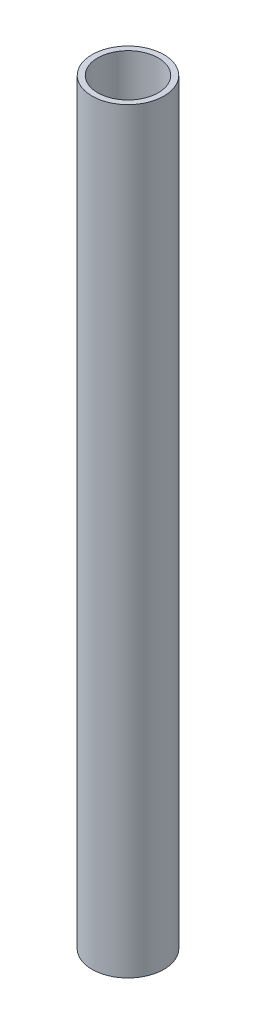
ISO-10303-21;
HEADER;
FILE_DESCRIPTION(('STEP AP214'),'2;1');
FILE_NAME('part.step','',(''),(''),'','','');
FILE_SCHEMA(('AUTOMOTIVE_DESIGN { 1 0 10303 214 1 1 1 1 }'));
ENDSEC;
DATA;
#1=APPLICATION_CONTEXT('core data for automotive mechanical design processes');
#2=APPLICATION_PROTOCOL_DEFINITION('international standard','automotive_design',2000,#1);
#3=PRODUCT_CONTEXT('',#1,'mechanical');
#4=PRODUCT('Part','Part','',(#3));
#5=PRODUCT_RELATED_PRODUCT_CATEGORY('part','',(#4));
#6=PRODUCT_DEFINITION_FORMATION('','',#4);
#7=PRODUCT_DEFINITION_CONTEXT('part definition',#1,'design');
#8=PRODUCT_DEFINITION('design','',#6,#7);
#9=PRODUCT_DEFINITION_SHAPE('','',#8);
#10=(LENGTH_UNIT() NAMED_UNIT(*) SI_UNIT(.MILLI.,.METRE.));
#11=(NAMED_UNIT(*) PLANE_ANGLE_UNIT() SI_UNIT($,.RADIAN.));
#12=(NAMED_UNIT(*) SI_UNIT($,.STERADIAN.) SOLID_ANGLE_UNIT());
#13=UNCERTAINTY_MEASURE_WITH_UNIT(LENGTH_MEASURE(1.E-05),#10,'distance_accuracy_value','');
#14=(GEOMETRIC_REPRESENTATION_CONTEXT(3) GLOBAL_UNCERTAINTY_ASSIGNED_CONTEXT((#13)) GLOBAL_UNIT_ASSIGNED_CONTEXT((#10,
#11,#12)) REPRESENTATION_CONTEXT('',''));
#15=CARTESIAN_POINT('',(0.,0.,0.));
#16=DIRECTION('',(0.,0.,1.));
#17=DIRECTION('',(1.,0.,0.));
#18=AXIS2_PLACEMENT_3D('',#15,#16,#17);
#19=CARTESIAN_POINT('',(0.,200.,0.));
#20=DIRECTION('',(0.,1.,0.));
#21=DIRECTION('',(0.,0.,1.));
#22=AXIS2_PLACEMENT_3D('',#19,#20,#21);
#23=PLANE('',#22);
#24=CARTESIAN_POINT('',(0.,200.,0.));
#25=DIRECTION('',(0.,1.,0.));
#26=DIRECTION('',(0.,0.,1.));
#27=AXIS2_PLACEMENT_3D('',#24,#25,#26);
#28=CIRCLE('',#27,9.5);
#29=CARTESIAN_POINT('',(0.,200.,9.5));
#30=VERTEX_POINT('',#29);
#31=EDGE_CURVE('E10',#30,#30,#28,.T.);
#32=ORIENTED_EDGE('',*,*,#31,.T.);
#33=EDGE_LOOP('',(#32));
#34=FACE_BOUND('',#33,.T.);
#35=CARTESIAN_POINT('',(0.,200.,0.));
#36=DIRECTION('',(0.,1.,0.));
#37=DIRECTION('',(0.,0.,1.));
#38=AXIS2_PLACEMENT_3D('',#35,#36,#37);
#39=CIRCLE('',#38,8.);
#40=CARTESIAN_POINT('',(0.,200.,8.));
#41=VERTEX_POINT('',#40);
#42=EDGE_CURVE('E50',#41,#41,#39,.T.);
#43=ORIENTED_EDGE('',*,*,#42,.F.);
#44=EDGE_LOOP('',(#43));
#45=FACE_BOUND('',#44,.T.);
#46=ADVANCED_FACE('F37',(#34,#45),#23,.T.);
#47=CARTESIAN_POINT('',(0.,0.,0.));
#48=DIRECTION('',(0.,1.,0.));
#49=DIRECTION('',(0.,0.,1.));
#50=AXIS2_PLACEMENT_3D('',#47,#48,#49);
#51=PLANE('',#50);
#52=CARTESIAN_POINT('',(0.,0.,0.));
#53=DIRECTION('',(0.,1.,0.));
#54=DIRECTION('',(0.,0.,1.));
#55=AXIS2_PLACEMENT_3D('',#52,#53,#54);
#56=CIRCLE('',#55,9.5);
#57=CARTESIAN_POINT('',(0.,0.,9.5));
#58=VERTEX_POINT('',#57);
#59=EDGE_CURVE('E41',#58,#58,#56,.T.);
#60=ORIENTED_EDGE('',*,*,#59,.F.);
#61=EDGE_LOOP('',(#60));
#62=FACE_BOUND('',#61,.T.);
#63=CARTESIAN_POINT('',(0.,0.,0.));
#64=DIRECTION('',(0.,1.,0.));
#65=DIRECTION('',(0.,0.,1.));
#66=AXIS2_PLACEMENT_3D('',#63,#64,#65);
#67=CIRCLE('',#66,8.);
#68=CARTESIAN_POINT('',(0.,0.,8.));
#69=VERTEX_POINT('',#68);
#70=EDGE_CURVE('E52',#69,#69,#67,.T.);
#71=ORIENTED_EDGE('',*,*,#70,.T.);
#72=EDGE_LOOP('',(#71));
#73=FACE_BOUND('',#72,.T.);
#74=ADVANCED_FACE('F64',(#62,#73),#51,.F.);
#75=CARTESIAN_POINT('',(0.,200.,0.));
#76=DIRECTION('',(0.,-1.,0.));
#77=DIRECTION('',(0.,0.,-1.));
#78=AXIS2_PLACEMENT_3D('',#75,#76,#77);
#79=CYLINDRICAL_SURFACE('',#78,9.5);
#80=ORIENTED_EDGE('',*,*,#31,.F.);
#81=EDGE_LOOP('',(#80));
#82=FACE_BOUND('',#81,.T.);
#83=ORIENTED_EDGE('',*,*,#59,.T.);
#84=EDGE_LOOP('',(#83));
#85=FACE_BOUND('',#84,.T.);
#86=ADVANCED_FACE('F39',(#82,#85),#79,.T.);
#87=CARTESIAN_POINT('',(0.,200.,0.));
#88=DIRECTION('',(0.,-1.,0.));
#89=DIRECTION('',(0.,0.,-1.));
#90=AXIS2_PLACEMENT_3D('',#87,#88,#89);
#91=CYLINDRICAL_SURFACE('',#90,8.);
#92=ORIENTED_EDGE('',*,*,#42,.T.);
#93=EDGE_LOOP('',(#92));
#94=FACE_BOUND('',#93,.T.);
#95=ORIENTED_EDGE('',*,*,#70,.F.);
#96=EDGE_LOOP('',(#95));
#97=FACE_BOUND('',#96,.T.);
#98=ADVANCED_FACE('F60',(#94,#97),#91,.F.);
#99=CLOSED_SHELL('',(#46,#74,#86,#98));
#100=MANIFOLD_SOLID_BREP('B2',#99);
#101=ADVANCED_BREP_SHAPE_REPRESENTATION('',(#18,#100),#14);
#102=SHAPE_DEFINITION_REPRESENTATION(#9,#101);
ENDSEC;
END-ISO-10303-21;
